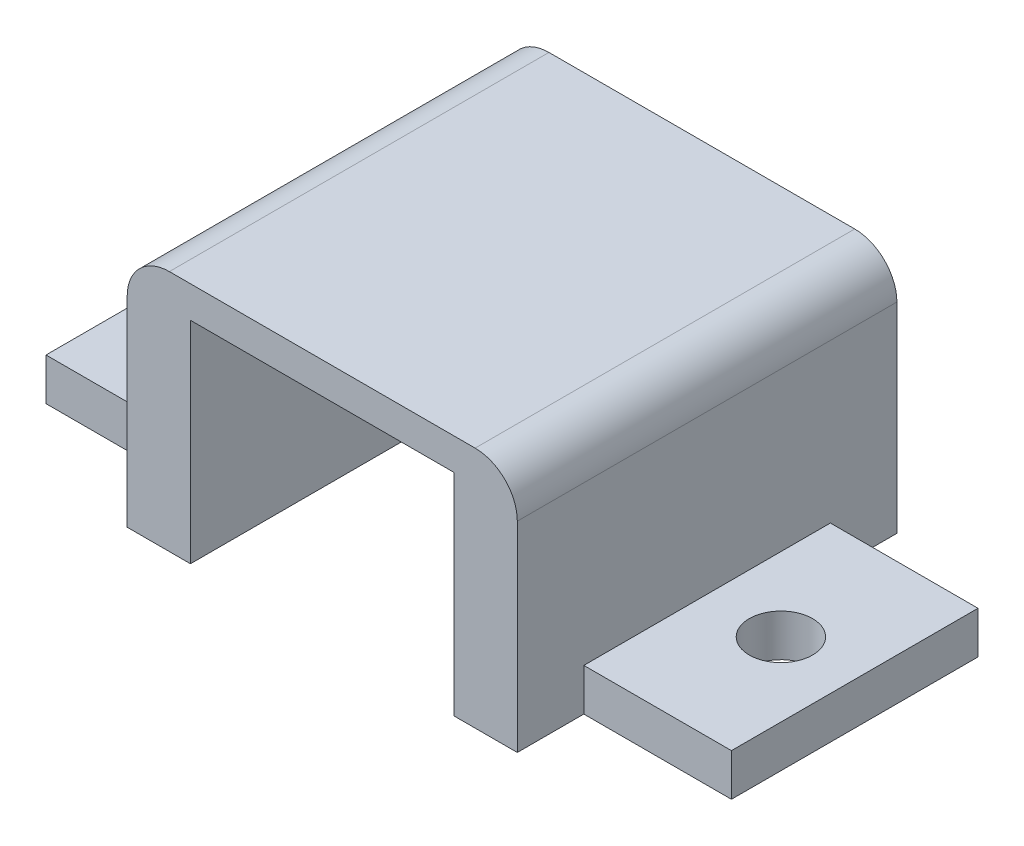
ISO-10303-21;
HEADER;
FILE_DESCRIPTION(('STEP AP214'),'2;1');
FILE_NAME('part.step','',(''),(''),'','','');
FILE_SCHEMA(('AUTOMOTIVE_DESIGN { 1 0 10303 214 1 1 1 1 }'));
ENDSEC;
DATA;
#1=APPLICATION_CONTEXT('core data for automotive mechanical design processes');
#2=APPLICATION_PROTOCOL_DEFINITION('international standard','automotive_design',2000,#1);
#3=PRODUCT_CONTEXT('',#1,'mechanical');
#4=PRODUCT('Part','Part','',(#3));
#5=PRODUCT_RELATED_PRODUCT_CATEGORY('part','',(#4));
#6=PRODUCT_DEFINITION_FORMATION('','',#4);
#7=PRODUCT_DEFINITION_CONTEXT('part definition',#1,'design');
#8=PRODUCT_DEFINITION('design','',#6,#7);
#9=PRODUCT_DEFINITION_SHAPE('','',#8);
#10=(LENGTH_UNIT() NAMED_UNIT(*) SI_UNIT(.MILLI.,.METRE.));
#11=(NAMED_UNIT(*) PLANE_ANGLE_UNIT() SI_UNIT($,.RADIAN.));
#12=(NAMED_UNIT(*) SI_UNIT($,.STERADIAN.) SOLID_ANGLE_UNIT());
#13=UNCERTAINTY_MEASURE_WITH_UNIT(LENGTH_MEASURE(1.E-05),#10,'distance_accuracy_value','');
#14=(GEOMETRIC_REPRESENTATION_CONTEXT(3) GLOBAL_UNCERTAINTY_ASSIGNED_CONTEXT((#13)) GLOBAL_UNIT_ASSIGNED_CONTEXT((#10,
#11,#12)) REPRESENTATION_CONTEXT('',''));
#15=CARTESIAN_POINT('',(0.,0.,0.));
#16=DIRECTION('',(0.,0.,1.));
#17=DIRECTION('',(1.,0.,0.));
#18=AXIS2_PLACEMENT_3D('',#15,#16,#17);
#19=CARTESIAN_POINT('',(-9.25,0.,18.));
#20=DIRECTION('',(1.,0.,0.));
#21=DIRECTION('',(0.,1.,0.));
#22=AXIS2_PLACEMENT_3D('',#19,#20,#21);
#23=PLANE('',#22);
#24=DIRECTION('',(0.,-1.,0.));
#25=VECTOR('',#24,1.);
#26=CARTESIAN_POINT('',(-9.25,0.,3.15));
#27=LINE('',#26,#25);
#28=CARTESIAN_POINT('',(-9.25,2.,3.15));
#29=VERTEX_POINT('',#28);
#30=CARTESIAN_POINT('',(-9.25,0.,3.15));
#31=VERTEX_POINT('',#30);
#32=EDGE_CURVE('E195',#29,#31,#27,.T.);
#33=ORIENTED_EDGE('',*,*,#32,.F.);
#34=DIRECTION('',(0.,0.,-1.));
#35=VECTOR('',#34,1.);
#36=CARTESIAN_POINT('',(-9.25,2.,3.15));
#37=LINE('',#36,#35);
#38=CARTESIAN_POINT('',(-9.25,2.,14.85));
#39=VERTEX_POINT('',#38);
#40=EDGE_CURVE('E62',#39,#29,#37,.T.);
#41=ORIENTED_EDGE('',*,*,#40,.F.);
#42=DIRECTION('',(0.,1.,0.));
#43=VECTOR('',#42,1.);
#44=CARTESIAN_POINT('',(-9.25,0.,14.85));
#45=LINE('',#44,#43);
#46=CARTESIAN_POINT('',(-9.25,0.,14.85));
#47=VERTEX_POINT('',#46);
#48=EDGE_CURVE('E469',#47,#39,#45,.T.);
#49=ORIENTED_EDGE('',*,*,#48,.F.);
#50=DIRECTION('',(0.,0.,-1.));
#51=VECTOR('',#50,1.);
#52=CARTESIAN_POINT('',(-9.25,0.,18.));
#53=LINE('',#52,#51);
#54=CARTESIAN_POINT('',(-9.25,0.,18.));
#55=VERTEX_POINT('',#54);
#56=EDGE_CURVE('E306',#55,#47,#53,.T.);
#57=ORIENTED_EDGE('',*,*,#56,.F.);
#58=DIRECTION('',(0.,-1.,0.));
#59=VECTOR('',#58,1.);
#60=CARTESIAN_POINT('',(-9.25,0.,18.));
#61=LINE('',#60,#59);
#62=CARTESIAN_POINT('',(-9.25,9.5,18.));
#63=VERTEX_POINT('',#62);
#64=EDGE_CURVE('E274',#63,#55,#61,.T.);
#65=ORIENTED_EDGE('',*,*,#64,.F.);
#66=DIRECTION('',(0.,0.,-1.));
#67=VECTOR('',#66,1.);
#68=CARTESIAN_POINT('',(-9.25,9.5,18.));
#69=LINE('',#68,#67);
#70=CARTESIAN_POINT('',(-9.25,9.5,0.));
#71=VERTEX_POINT('',#70);
#72=EDGE_CURVE('E309',#63,#71,#69,.T.);
#73=ORIENTED_EDGE('',*,*,#72,.T.);
#74=DIRECTION('',(0.,-1.,0.));
#75=VECTOR('',#74,1.);
#76=CARTESIAN_POINT('',(-9.25,0.,0.));
#77=LINE('',#76,#75);
#78=CARTESIAN_POINT('',(-9.25,0.,0.));
#79=VERTEX_POINT('',#78);
#80=EDGE_CURVE('E250',#71,#79,#77,.T.);
#81=ORIENTED_EDGE('',*,*,#80,.T.);
#82=EDGE_CURVE('E68',#31,#79,#53,.T.);
#83=ORIENTED_EDGE('',*,*,#82,.F.);
#84=EDGE_LOOP('',(#33,#41,#49,#57,#65,#73,#81,#83));
#85=FACE_BOUND('',#84,.T.);
#86=ADVANCED_FACE('F45',(#85),#23,.F.);
#87=CARTESIAN_POINT('',(9.25,9.5,18.));
#88=DIRECTION('',(-1.,0.,0.));
#89=DIRECTION('',(0.,-1.,0.));
#90=AXIS2_PLACEMENT_3D('',#87,#88,#89);
#91=PLANE('',#90);
#92=DIRECTION('',(0.,-1.,0.));
#93=VECTOR('',#92,1.);
#94=CARTESIAN_POINT('',(9.25,0.,14.846138672784));
#95=LINE('',#94,#93);
#96=CARTESIAN_POINT('',(9.25,2.,14.846138672784));
#97=VERTEX_POINT('',#96);
#98=CARTESIAN_POINT('',(9.25,0.,14.846138672784));
#99=VERTEX_POINT('',#98);
#100=EDGE_CURVE('E197',#97,#99,#95,.T.);
#101=ORIENTED_EDGE('',*,*,#100,.F.);
#102=DIRECTION('',(0.,0.,1.));
#103=VECTOR('',#102,1.);
#104=CARTESIAN_POINT('',(9.25,2.,14.846138672784));
#105=LINE('',#104,#103);
#106=CARTESIAN_POINT('',(9.25,2.,3.15386132721602));
#107=VERTEX_POINT('',#106);
#108=EDGE_CURVE('E213',#107,#97,#105,.T.);
#109=ORIENTED_EDGE('',*,*,#108,.F.);
#110=DIRECTION('',(0.,1.,0.));
#111=VECTOR('',#110,1.);
#112=CARTESIAN_POINT('',(9.25,0.,3.15386132721602));
#113=LINE('',#112,#111);
#114=CARTESIAN_POINT('',(9.25,0.,3.15386132721602));
#115=VERTEX_POINT('',#114);
#116=EDGE_CURVE('E202',#115,#107,#113,.T.);
#117=ORIENTED_EDGE('',*,*,#116,.F.);
#118=DIRECTION('',(0.,0.,-1.));
#119=VECTOR('',#118,1.);
#120=CARTESIAN_POINT('',(9.25,0.,18.));
#121=LINE('',#120,#119);
#122=CARTESIAN_POINT('',(9.25,0.,0.));
#123=VERTEX_POINT('',#122);
#124=EDGE_CURVE('E325',#115,#123,#121,.T.);
#125=ORIENTED_EDGE('',*,*,#124,.T.);
#126=DIRECTION('',(0.,1.,0.));
#127=VECTOR('',#126,1.);
#128=CARTESIAN_POINT('',(9.25,9.5,0.));
#129=LINE('',#128,#127);
#130=CARTESIAN_POINT('',(9.25,9.5,0.));
#131=VERTEX_POINT('',#130);
#132=EDGE_CURVE('E292',#123,#131,#129,.T.);
#133=ORIENTED_EDGE('',*,*,#132,.T.);
#134=DIRECTION('',(0.,0.,-1.));
#135=VECTOR('',#134,1.);
#136=CARTESIAN_POINT('',(9.25,9.5,18.));
#137=LINE('',#136,#135);
#138=CARTESIAN_POINT('',(9.25,9.5,18.));
#139=VERTEX_POINT('',#138);
#140=EDGE_CURVE('E321',#139,#131,#137,.T.);
#141=ORIENTED_EDGE('',*,*,#140,.F.);
#142=DIRECTION('',(0.,1.,0.));
#143=VECTOR('',#142,1.);
#144=CARTESIAN_POINT('',(9.25,9.5,18.));
#145=LINE('',#144,#143);
#146=CARTESIAN_POINT('',(9.25,0.,18.));
#147=VERTEX_POINT('',#146);
#148=EDGE_CURVE('E262',#147,#139,#145,.T.);
#149=ORIENTED_EDGE('',*,*,#148,.F.);
#150=EDGE_CURVE('E326',#147,#99,#121,.T.);
#151=ORIENTED_EDGE('',*,*,#150,.T.);
#152=EDGE_LOOP('',(#101,#109,#117,#125,#133,#141,#149,#151));
#153=FACE_BOUND('',#152,.T.);
#154=ADVANCED_FACE('F387',(#153),#91,.F.);
#155=CARTESIAN_POINT('',(-6.25,0.,18.));
#156=DIRECTION('',(0.,1.,0.));
#157=DIRECTION('',(-1.,0.,0.));
#158=AXIS2_PLACEMENT_3D('',#155,#156,#157);
#159=PLANE('',#158);
#160=CARTESIAN_POINT('',(-12.75,0.,9.));
#161=DIRECTION('',(0.,-1.,0.));
#162=DIRECTION('',(0.,0.,-1.));
#163=AXIS2_PLACEMENT_3D('',#160,#161,#162);
#164=CIRCLE('',#163,1.49999999999999);
#165=CARTESIAN_POINT('',(-12.75,0.,7.50000000000001));
#166=VERTEX_POINT('',#165);
#167=EDGE_CURVE('E448',#166,#166,#164,.T.);
#168=ORIENTED_EDGE('',*,*,#167,.F.);
#169=EDGE_LOOP('',(#168));
#170=FACE_BOUND('',#169,.T.);
#171=DIRECTION('',(1.,0.,0.));
#172=VECTOR('',#171,1.);
#173=CARTESIAN_POINT('',(-6.25,0.,0.));
#174=LINE('',#173,#172);
#175=CARTESIAN_POINT('',(-6.25,0.,0.));
#176=VERTEX_POINT('',#175);
#177=EDGE_CURVE('E244',#79,#176,#174,.T.);
#178=ORIENTED_EDGE('',*,*,#177,.T.);
#179=DIRECTION('',(0.,0.,-1.));
#180=VECTOR('',#179,1.);
#181=CARTESIAN_POINT('',(-6.25,0.,18.));
#182=LINE('',#181,#180);
#183=CARTESIAN_POINT('',(-6.25,0.,18.));
#184=VERTEX_POINT('',#183);
#185=EDGE_CURVE('E11',#184,#176,#182,.T.);
#186=ORIENTED_EDGE('',*,*,#185,.F.);
#187=DIRECTION('',(1.,0.,0.));
#188=VECTOR('',#187,1.);
#189=CARTESIAN_POINT('',(-6.25,0.,18.));
#190=LINE('',#189,#188);
#191=EDGE_CURVE('E245',#55,#184,#190,.T.);
#192=ORIENTED_EDGE('',*,*,#191,.F.);
#193=ORIENTED_EDGE('',*,*,#56,.T.);
#194=DIRECTION('',(1.,0.,0.));
#195=VECTOR('',#194,1.);
#196=CARTESIAN_POINT('',(-16.25,0.,14.85));
#197=LINE('',#196,#195);
#198=CARTESIAN_POINT('',(-16.25,0.,14.85));
#199=VERTEX_POINT('',#198);
#200=EDGE_CURVE('E178',#199,#47,#197,.T.);
#201=ORIENTED_EDGE('',*,*,#200,.F.);
#202=DIRECTION('',(0.,0.,1.));
#203=VECTOR('',#202,1.);
#204=CARTESIAN_POINT('',(-16.25,0.,3.15));
#205=LINE('',#204,#203);
#206=CARTESIAN_POINT('',(-16.25,0.,3.15));
#207=VERTEX_POINT('',#206);
#208=EDGE_CURVE('E170',#207,#199,#205,.T.);
#209=ORIENTED_EDGE('',*,*,#208,.F.);
#210=DIRECTION('',(1.,0.,0.));
#211=VECTOR('',#210,1.);
#212=CARTESIAN_POINT('',(-16.25,0.,3.15));
#213=LINE('',#212,#211);
#214=EDGE_CURVE('E174',#207,#31,#213,.T.);
#215=ORIENTED_EDGE('',*,*,#214,.T.);
#216=ORIENTED_EDGE('',*,*,#82,.T.);
#217=EDGE_LOOP('',(#178,#186,#192,#193,#201,#209,#215,#216));
#218=FACE_BOUND('',#217,.T.);
#219=ADVANCED_FACE('F47',(#170,#218),#159,.F.);
#220=CARTESIAN_POINT('',(-6.25,10.,18.));
#221=DIRECTION('',(-1.,0.,0.));
#222=DIRECTION('',(0.,0.,1.));
#223=AXIS2_PLACEMENT_3D('',#220,#221,#222);
#224=PLANE('',#223);
#225=DIRECTION('',(0.,1.,0.));
#226=VECTOR('',#225,1.);
#227=CARTESIAN_POINT('',(-6.25,10.,0.));
#228=LINE('',#227,#226);
#229=CARTESIAN_POINT('',(-6.25,10.,0.));
#230=VERTEX_POINT('',#229);
#231=EDGE_CURVE('E279',#176,#230,#228,.T.);
#232=ORIENTED_EDGE('',*,*,#231,.T.);
#233=DIRECTION('',(0.,0.,-1.));
#234=VECTOR('',#233,1.);
#235=CARTESIAN_POINT('',(-6.25,10.,18.));
#236=LINE('',#235,#234);
#237=CARTESIAN_POINT('',(-6.25,10.,18.));
#238=VERTEX_POINT('',#237);
#239=EDGE_CURVE('E55',#238,#230,#236,.T.);
#240=ORIENTED_EDGE('',*,*,#239,.F.);
#241=DIRECTION('',(0.,1.,0.));
#242=VECTOR('',#241,1.);
#243=CARTESIAN_POINT('',(-6.25,10.,18.));
#244=LINE('',#243,#242);
#245=EDGE_CURVE('E249',#184,#238,#244,.T.);
#246=ORIENTED_EDGE('',*,*,#245,.F.);
#247=ORIENTED_EDGE('',*,*,#185,.T.);
#248=EDGE_LOOP('',(#232,#240,#246,#247));
#249=FACE_BOUND('',#248,.T.);
#250=ADVANCED_FACE('F367',(#249),#224,.F.);
#251=CARTESIAN_POINT('',(6.25,10.,18.));
#252=DIRECTION('',(0.,1.,0.));
#253=DIRECTION('',(0.,0.,1.));
#254=AXIS2_PLACEMENT_3D('',#251,#252,#253);
#255=PLANE('',#254);
#256=DIRECTION('',(1.,0.,0.));
#257=VECTOR('',#256,1.);
#258=CARTESIAN_POINT('',(6.25,10.,0.));
#259=LINE('',#258,#257);
#260=CARTESIAN_POINT('',(6.25,10.,0.));
#261=VERTEX_POINT('',#260);
#262=EDGE_CURVE('E282',#230,#261,#259,.T.);
#263=ORIENTED_EDGE('',*,*,#262,.T.);
#264=DIRECTION('',(0.,0.,-1.));
#265=VECTOR('',#264,1.);
#266=CARTESIAN_POINT('',(6.25,10.,18.));
#267=LINE('',#266,#265);
#268=CARTESIAN_POINT('',(6.25,10.,18.));
#269=VERTEX_POINT('',#268);
#270=EDGE_CURVE('E333',#269,#261,#267,.T.);
#271=ORIENTED_EDGE('',*,*,#270,.F.);
#272=DIRECTION('',(1.,0.,0.));
#273=VECTOR('',#272,1.);
#274=CARTESIAN_POINT('',(6.25,10.,18.));
#275=LINE('',#274,#273);
#276=EDGE_CURVE('E253',#238,#269,#275,.T.);
#277=ORIENTED_EDGE('',*,*,#276,.F.);
#278=ORIENTED_EDGE('',*,*,#239,.T.);
#279=EDGE_LOOP('',(#263,#271,#277,#278));
#280=FACE_BOUND('',#279,.T.);
#281=ADVANCED_FACE('F343',(#280),#255,.F.);
#282=CARTESIAN_POINT('',(6.25,0.,18.));
#283=DIRECTION('',(1.,0.,0.));
#284=DIRECTION('',(0.,0.,-1.));
#285=AXIS2_PLACEMENT_3D('',#282,#283,#284);
#286=PLANE('',#285);
#287=DIRECTION('',(0.,-1.,0.));
#288=VECTOR('',#287,1.);
#289=CARTESIAN_POINT('',(6.25,0.,0.));
#290=LINE('',#289,#288);
#291=CARTESIAN_POINT('',(6.25,0.,0.));
#292=VERTEX_POINT('',#291);
#293=EDGE_CURVE('E285',#261,#292,#290,.T.);
#294=ORIENTED_EDGE('',*,*,#293,.T.);
#295=DIRECTION('',(0.,0.,-1.));
#296=VECTOR('',#295,1.);
#297=CARTESIAN_POINT('',(6.25,0.,18.));
#298=LINE('',#297,#296);
#299=CARTESIAN_POINT('',(6.25,0.,18.));
#300=VERTEX_POINT('',#299);
#301=EDGE_CURVE('E329',#300,#292,#298,.T.);
#302=ORIENTED_EDGE('',*,*,#301,.F.);
#303=DIRECTION('',(0.,-1.,0.));
#304=VECTOR('',#303,1.);
#305=CARTESIAN_POINT('',(6.25,0.,18.));
#306=LINE('',#305,#304);
#307=EDGE_CURVE('E256',#269,#300,#306,.T.);
#308=ORIENTED_EDGE('',*,*,#307,.F.);
#309=ORIENTED_EDGE('',*,*,#270,.T.);
#310=EDGE_LOOP('',(#294,#302,#308,#309));
#311=FACE_BOUND('',#310,.T.);
#312=ADVANCED_FACE('F354',(#311),#286,.F.);
#313=CARTESIAN_POINT('',(9.25,0.,18.));
#314=DIRECTION('',(0.,1.,0.));
#315=DIRECTION('',(-1.,0.,0.));
#316=AXIS2_PLACEMENT_3D('',#313,#314,#315);
#317=PLANE('',#316);
#318=CARTESIAN_POINT('',(12.75,0.,9.));
#319=DIRECTION('',(0.,-1.,0.));
#320=DIRECTION('',(0.,0.,-1.));
#321=AXIS2_PLACEMENT_3D('',#318,#319,#320);
#322=CIRCLE('',#321,1.49999999999999);
#323=CARTESIAN_POINT('',(12.75,0.,7.50000000000001));
#324=VERTEX_POINT('',#323);
#325=EDGE_CURVE('E454',#324,#324,#322,.T.);
#326=ORIENTED_EDGE('',*,*,#325,.F.);
#327=EDGE_LOOP('',(#326));
#328=FACE_BOUND('',#327,.T.);
#329=DIRECTION('',(1.,0.,0.));
#330=VECTOR('',#329,1.);
#331=CARTESIAN_POINT('',(9.25,0.,0.));
#332=LINE('',#331,#330);
#333=EDGE_CURVE('E288',#292,#123,#332,.T.);
#334=ORIENTED_EDGE('',*,*,#333,.T.);
#335=ORIENTED_EDGE('',*,*,#124,.F.);
#336=DIRECTION('',(-1.,0.,0.));
#337=VECTOR('',#336,1.);
#338=CARTESIAN_POINT('',(16.25,0.,3.15386132721602));
#339=LINE('',#338,#337);
#340=CARTESIAN_POINT('',(16.25,0.,3.15386132721602));
#341=VERTEX_POINT('',#340);
#342=EDGE_CURVE('E236',#341,#115,#339,.T.);
#343=ORIENTED_EDGE('',*,*,#342,.F.);
#344=DIRECTION('',(0.,0.,-1.));
#345=VECTOR('',#344,1.);
#346=CARTESIAN_POINT('',(16.25,0.,14.846138672784));
#347=LINE('',#346,#345);
#348=CARTESIAN_POINT('',(16.25,0.,14.846138672784));
#349=VERTEX_POINT('',#348);
#350=EDGE_CURVE('E212',#349,#341,#347,.T.);
#351=ORIENTED_EDGE('',*,*,#350,.F.);
#352=DIRECTION('',(-1.,0.,0.));
#353=VECTOR('',#352,1.);
#354=CARTESIAN_POINT('',(16.25,0.,14.846138672784));
#355=LINE('',#354,#353);
#356=EDGE_CURVE('E240',#349,#99,#355,.T.);
#357=ORIENTED_EDGE('',*,*,#356,.T.);
#358=ORIENTED_EDGE('',*,*,#150,.F.);
#359=DIRECTION('',(1.,0.,0.));
#360=VECTOR('',#359,1.);
#361=CARTESIAN_POINT('',(9.25,0.,18.));
#362=LINE('',#361,#360);
#363=EDGE_CURVE('E259',#300,#147,#362,.T.);
#364=ORIENTED_EDGE('',*,*,#363,.F.);
#365=ORIENTED_EDGE('',*,*,#301,.T.);
#366=EDGE_LOOP('',(#334,#335,#343,#351,#357,#358,#364,#365));
#367=FACE_BOUND('',#366,.T.);
#368=ADVANCED_FACE('F358',(#328,#367),#317,.F.);
#369=CARTESIAN_POINT('',(7.25,9.5,18.));
#370=DIRECTION('',(0.,0.,-1.));
#371=DIRECTION('',(-1.,0.,0.));
#372=AXIS2_PLACEMENT_3D('',#369,#370,#371);
#373=CYLINDRICAL_SURFACE('',#372,2.);
#374=CARTESIAN_POINT('',(7.25,9.5,0.));
#375=DIRECTION('',(0.,0.,1.));
#376=DIRECTION('',(-1.,0.,0.));
#377=AXIS2_PLACEMENT_3D('',#374,#375,#376);
#378=CIRCLE('',#377,2.);
#379=CARTESIAN_POINT('',(7.25,11.5,0.));
#380=VERTEX_POINT('',#379);
#381=EDGE_CURVE('E295',#131,#380,#378,.T.);
#382=ORIENTED_EDGE('',*,*,#381,.T.);
#383=DIRECTION('',(0.,0.,-1.));
#384=VECTOR('',#383,1.);
#385=CARTESIAN_POINT('',(7.25,11.5,18.));
#386=LINE('',#385,#384);
#387=CARTESIAN_POINT('',(7.25,11.5,18.));
#388=VERTEX_POINT('',#387);
#389=EDGE_CURVE('E317',#388,#380,#386,.T.);
#390=ORIENTED_EDGE('',*,*,#389,.F.);
#391=CARTESIAN_POINT('',(7.25,9.5,18.));
#392=DIRECTION('',(0.,0.,1.));
#393=DIRECTION('',(-1.,0.,0.));
#394=AXIS2_PLACEMENT_3D('',#391,#392,#393);
#395=CIRCLE('',#394,2.);
#396=EDGE_CURVE('E265',#139,#388,#395,.T.);
#397=ORIENTED_EDGE('',*,*,#396,.F.);
#398=ORIENTED_EDGE('',*,*,#140,.T.);
#399=EDGE_LOOP('',(#382,#390,#397,#398));
#400=FACE_BOUND('',#399,.T.);
#401=ADVANCED_FACE('F384',(#400),#373,.T.);
#402=CARTESIAN_POINT('',(-7.25,11.5,18.));
#403=DIRECTION('',(0.,-1.,0.));
#404=DIRECTION('',(0.,0.,-1.));
#405=AXIS2_PLACEMENT_3D('',#402,#403,#404);
#406=PLANE('',#405);
#407=DIRECTION('',(-1.,0.,0.));
#408=VECTOR('',#407,1.);
#409=CARTESIAN_POINT('',(-7.25,11.5,0.));
#410=LINE('',#409,#408);
#411=CARTESIAN_POINT('',(-7.25,11.5,0.));
#412=VERTEX_POINT('',#411);
#413=EDGE_CURVE('E298',#380,#412,#410,.T.);
#414=ORIENTED_EDGE('',*,*,#413,.T.);
#415=DIRECTION('',(0.,0.,-1.));
#416=VECTOR('',#415,1.);
#417=CARTESIAN_POINT('',(-7.25,11.5,18.));
#418=LINE('',#417,#416);
#419=CARTESIAN_POINT('',(-7.25,11.5,18.));
#420=VERTEX_POINT('',#419);
#421=EDGE_CURVE('E313',#420,#412,#418,.T.);
#422=ORIENTED_EDGE('',*,*,#421,.F.);
#423=DIRECTION('',(-1.,0.,0.));
#424=VECTOR('',#423,1.);
#425=CARTESIAN_POINT('',(-7.25,11.5,18.));
#426=LINE('',#425,#424);
#427=EDGE_CURVE('E268',#388,#420,#426,.T.);
#428=ORIENTED_EDGE('',*,*,#427,.F.);
#429=ORIENTED_EDGE('',*,*,#389,.T.);
#430=EDGE_LOOP('',(#414,#422,#428,#429));
#431=FACE_BOUND('',#430,.T.);
#432=ADVANCED_FACE('F380',(#431),#406,.F.);
#433=CARTESIAN_POINT('',(-7.25,9.5,18.));
#434=DIRECTION('',(0.,0.,-1.));
#435=DIRECTION('',(-1.,0.,0.));
#436=AXIS2_PLACEMENT_3D('',#433,#434,#435);
#437=CYLINDRICAL_SURFACE('',#436,2.);
#438=CARTESIAN_POINT('',(-7.25,9.5,0.));
#439=DIRECTION('',(0.,0.,1.));
#440=DIRECTION('',(-1.,0.,0.));
#441=AXIS2_PLACEMENT_3D('',#438,#439,#440);
#442=CIRCLE('',#441,2.);
#443=EDGE_CURVE('E301',#412,#71,#442,.T.);
#444=ORIENTED_EDGE('',*,*,#443,.T.);
#445=ORIENTED_EDGE('',*,*,#72,.F.);
#446=CARTESIAN_POINT('',(-7.25,9.5,18.));
#447=DIRECTION('',(0.,0.,1.));
#448=DIRECTION('',(-1.,0.,0.));
#449=AXIS2_PLACEMENT_3D('',#446,#447,#448);
#450=CIRCLE('',#449,2.);
#451=EDGE_CURVE('E271',#420,#63,#450,.T.);
#452=ORIENTED_EDGE('',*,*,#451,.F.);
#453=ORIENTED_EDGE('',*,*,#421,.T.);
#454=EDGE_LOOP('',(#444,#445,#452,#453));
#455=FACE_BOUND('',#454,.T.);
#456=ADVANCED_FACE('F376',(#455),#437,.T.);
#457=CARTESIAN_POINT('',(-7.25,9.5,18.));
#458=DIRECTION('',(0.,0.,-1.));
#459=DIRECTION('',(-1.,0.,0.));
#460=AXIS2_PLACEMENT_3D('',#457,#458,#459);
#461=PLANE('',#460);
#462=ORIENTED_EDGE('',*,*,#191,.T.);
#463=ORIENTED_EDGE('',*,*,#245,.T.);
#464=ORIENTED_EDGE('',*,*,#276,.T.);
#465=ORIENTED_EDGE('',*,*,#307,.T.);
#466=ORIENTED_EDGE('',*,*,#363,.T.);
#467=ORIENTED_EDGE('',*,*,#148,.T.);
#468=ORIENTED_EDGE('',*,*,#396,.T.);
#469=ORIENTED_EDGE('',*,*,#427,.T.);
#470=ORIENTED_EDGE('',*,*,#451,.T.);
#471=ORIENTED_EDGE('',*,*,#64,.T.);
#472=EDGE_LOOP('',(#462,#463,#464,#465,#466,#467,#468,#469,#470,#471));
#473=FACE_BOUND('',#472,.T.);
#474=ADVANCED_FACE('F363',(#473),#461,.F.);
#475=CARTESIAN_POINT('',(-7.25,9.5,0.));
#476=DIRECTION('',(0.,0.,-1.));
#477=DIRECTION('',(-1.,0.,0.));
#478=AXIS2_PLACEMENT_3D('',#475,#476,#477);
#479=PLANE('',#478);
#480=ORIENTED_EDGE('',*,*,#177,.F.);
#481=ORIENTED_EDGE('',*,*,#80,.F.);
#482=ORIENTED_EDGE('',*,*,#443,.F.);
#483=ORIENTED_EDGE('',*,*,#413,.F.);
#484=ORIENTED_EDGE('',*,*,#381,.F.);
#485=ORIENTED_EDGE('',*,*,#132,.F.);
#486=ORIENTED_EDGE('',*,*,#333,.F.);
#487=ORIENTED_EDGE('',*,*,#293,.F.);
#488=ORIENTED_EDGE('',*,*,#262,.F.);
#489=ORIENTED_EDGE('',*,*,#231,.F.);
#490=EDGE_LOOP('',(#480,#481,#482,#483,#484,#485,#486,#487,#488,#489));
#491=FACE_BOUND('',#490,.T.);
#492=ADVANCED_FACE('F349',(#491),#479,.T.);
#493=CARTESIAN_POINT('',(16.25,0.,14.846138672784));
#494=DIRECTION('',(0.,0.,-1.));
#495=DIRECTION('',(-1.,0.,0.));
#496=AXIS2_PLACEMENT_3D('',#493,#494,#495);
#497=PLANE('',#496);
#498=ORIENTED_EDGE('',*,*,#100,.T.);
#499=ORIENTED_EDGE('',*,*,#356,.F.);
#500=DIRECTION('',(0.,-1.,0.));
#501=VECTOR('',#500,1.);
#502=CARTESIAN_POINT('',(16.25,0.,14.846138672784));
#503=LINE('',#502,#501);
#504=CARTESIAN_POINT('',(16.25,2.,14.846138672784));
#505=VERTEX_POINT('',#504);
#506=EDGE_CURVE('E208',#505,#349,#503,.T.);
#507=ORIENTED_EDGE('',*,*,#506,.F.);
#508=DIRECTION('',(-1.,0.,0.));
#509=VECTOR('',#508,1.);
#510=CARTESIAN_POINT('',(16.25,2.,14.846138672784));
#511=LINE('',#510,#509);
#512=EDGE_CURVE('E221',#505,#97,#511,.T.);
#513=ORIENTED_EDGE('',*,*,#512,.T.);
#514=EDGE_LOOP('',(#498,#499,#507,#513));
#515=FACE_BOUND('',#514,.T.);
#516=ADVANCED_FACE('F402',(#515),#497,.F.);
#517=CARTESIAN_POINT('',(16.25,0.,3.15386132721602));
#518=DIRECTION('',(0.,0.,1.));
#519=DIRECTION('',(0.,-1.,0.));
#520=AXIS2_PLACEMENT_3D('',#517,#518,#519);
#521=PLANE('',#520);
#522=ORIENTED_EDGE('',*,*,#116,.T.);
#523=DIRECTION('',(-1.,0.,0.));
#524=VECTOR('',#523,1.);
#525=CARTESIAN_POINT('',(16.25,2.,3.15386132721602));
#526=LINE('',#525,#524);
#527=CARTESIAN_POINT('',(16.25,2.,3.15386132721602));
#528=VERTEX_POINT('',#527);
#529=EDGE_CURVE('E232',#528,#107,#526,.T.);
#530=ORIENTED_EDGE('',*,*,#529,.F.);
#531=DIRECTION('',(0.,1.,0.));
#532=VECTOR('',#531,1.);
#533=CARTESIAN_POINT('',(16.25,0.,3.15386132721602));
#534=LINE('',#533,#532);
#535=EDGE_CURVE('E216',#341,#528,#534,.T.);
#536=ORIENTED_EDGE('',*,*,#535,.F.);
#537=ORIENTED_EDGE('',*,*,#342,.T.);
#538=EDGE_LOOP('',(#522,#530,#536,#537));
#539=FACE_BOUND('',#538,.T.);
#540=ADVANCED_FACE('F393',(#539),#521,.F.);
#541=CARTESIAN_POINT('',(16.25,2.,14.846138672784));
#542=DIRECTION('',(0.,-1.,0.));
#543=DIRECTION('',(1.,0.,0.));
#544=AXIS2_PLACEMENT_3D('',#541,#542,#543);
#545=PLANE('',#544);
#546=CARTESIAN_POINT('',(12.75,2.,9.));
#547=DIRECTION('',(0.,-1.,0.));
#548=DIRECTION('',(1.,0.,0.));
#549=AXIS2_PLACEMENT_3D('',#546,#547,#548);
#550=CIRCLE('',#549,1.49999999999999);
#551=CARTESIAN_POINT('',(14.25,2.,9.));
#552=VERTEX_POINT('',#551);
#553=EDGE_CURVE('E459',#552,#552,#550,.T.);
#554=ORIENTED_EDGE('',*,*,#553,.T.);
#555=EDGE_LOOP('',(#554));
#556=FACE_BOUND('',#555,.T.);
#557=ORIENTED_EDGE('',*,*,#108,.T.);
#558=ORIENTED_EDGE('',*,*,#512,.F.);
#559=DIRECTION('',(0.,0.,1.));
#560=VECTOR('',#559,1.);
#561=CARTESIAN_POINT('',(16.25,2.,14.846138672784));
#562=LINE('',#561,#560);
#563=EDGE_CURVE('E219',#528,#505,#562,.T.);
#564=ORIENTED_EDGE('',*,*,#563,.F.);
#565=ORIENTED_EDGE('',*,*,#529,.T.);
#566=EDGE_LOOP('',(#557,#558,#564,#565));
#567=FACE_BOUND('',#566,.T.);
#568=ADVANCED_FACE('F404',(#556,#567),#545,.F.);
#569=CARTESIAN_POINT('',(16.25,0.,0.));
#570=DIRECTION('',(-1.,0.,0.));
#571=DIRECTION('',(0.,0.,1.));
#572=AXIS2_PLACEMENT_3D('',#569,#570,#571);
#573=PLANE('',#572);
#574=ORIENTED_EDGE('',*,*,#506,.T.);
#575=ORIENTED_EDGE('',*,*,#350,.T.);
#576=ORIENTED_EDGE('',*,*,#535,.T.);
#577=ORIENTED_EDGE('',*,*,#563,.T.);
#578=EDGE_LOOP('',(#574,#575,#576,#577));
#579=FACE_BOUND('',#578,.T.);
#580=ADVANCED_FACE('F397',(#579),#573,.F.);
#581=CARTESIAN_POINT('',(-16.25,0.,3.15));
#582=DIRECTION('',(0.,0.,1.));
#583=DIRECTION('',(1.,0.,0.));
#584=AXIS2_PLACEMENT_3D('',#581,#582,#583);
#585=PLANE('',#584);
#586=ORIENTED_EDGE('',*,*,#32,.T.);
#587=ORIENTED_EDGE('',*,*,#214,.F.);
#588=DIRECTION('',(0.,-1.,0.));
#589=VECTOR('',#588,1.);
#590=CARTESIAN_POINT('',(-16.25,0.,3.15));
#591=LINE('',#590,#589);
#592=CARTESIAN_POINT('',(-16.25,2.,3.15));
#593=VERTEX_POINT('',#592);
#594=EDGE_CURVE('E183',#593,#207,#591,.T.);
#595=ORIENTED_EDGE('',*,*,#594,.F.);
#596=DIRECTION('',(1.,0.,0.));
#597=VECTOR('',#596,1.);
#598=CARTESIAN_POINT('',(-16.25,2.,3.15));
#599=LINE('',#598,#597);
#600=EDGE_CURVE('E466',#593,#29,#599,.T.);
#601=ORIENTED_EDGE('',*,*,#600,.T.);
#602=EDGE_LOOP('',(#586,#587,#595,#601));
#603=FACE_BOUND('',#602,.T.);
#604=ADVANCED_FACE('F194',(#603),#585,.F.);
#605=CARTESIAN_POINT('',(-16.25,0.,14.85));
#606=DIRECTION('',(0.,0.,-1.));
#607=DIRECTION('',(-1.,0.,0.));
#608=AXIS2_PLACEMENT_3D('',#605,#606,#607);
#609=PLANE('',#608);
#610=ORIENTED_EDGE('',*,*,#48,.T.);
#611=DIRECTION('',(1.,0.,0.));
#612=VECTOR('',#611,1.);
#613=CARTESIAN_POINT('',(-16.25,2.,14.85));
#614=LINE('',#613,#612);
#615=CARTESIAN_POINT('',(-16.25,2.,14.85));
#616=VERTEX_POINT('',#615);
#617=EDGE_CURVE('E204',#616,#39,#614,.T.);
#618=ORIENTED_EDGE('',*,*,#617,.F.);
#619=DIRECTION('',(0.,1.,0.));
#620=VECTOR('',#619,1.);
#621=CARTESIAN_POINT('',(-16.25,0.,14.85));
#622=LINE('',#621,#620);
#623=EDGE_CURVE('E182',#199,#616,#622,.T.);
#624=ORIENTED_EDGE('',*,*,#623,.F.);
#625=ORIENTED_EDGE('',*,*,#200,.T.);
#626=EDGE_LOOP('',(#610,#618,#624,#625));
#627=FACE_BOUND('',#626,.T.);
#628=ADVANCED_FACE('F481',(#627),#609,.F.);
#629=CARTESIAN_POINT('',(-16.25,2.,3.15));
#630=DIRECTION('',(0.,-1.,0.));
#631=DIRECTION('',(1.,0.,0.));
#632=AXIS2_PLACEMENT_3D('',#629,#630,#631);
#633=PLANE('',#632);
#634=CARTESIAN_POINT('',(-12.75,2.,9.));
#635=DIRECTION('',(0.,-1.,0.));
#636=DIRECTION('',(1.,0.,0.));
#637=AXIS2_PLACEMENT_3D('',#634,#635,#636);
#638=CIRCLE('',#637,1.49999999999999);
#639=CARTESIAN_POINT('',(-11.25,2.,9.));
#640=VERTEX_POINT('',#639);
#641=EDGE_CURVE('E49',#640,#640,#638,.T.);
#642=ORIENTED_EDGE('',*,*,#641,.T.);
#643=EDGE_LOOP('',(#642));
#644=FACE_BOUND('',#643,.T.);
#645=ORIENTED_EDGE('',*,*,#40,.T.);
#646=ORIENTED_EDGE('',*,*,#600,.F.);
#647=DIRECTION('',(0.,0.,-1.));
#648=VECTOR('',#647,1.);
#649=CARTESIAN_POINT('',(-16.25,2.,3.15));
#650=LINE('',#649,#648);
#651=EDGE_CURVE('E188',#616,#593,#650,.T.);
#652=ORIENTED_EDGE('',*,*,#651,.F.);
#653=ORIENTED_EDGE('',*,*,#617,.T.);
#654=EDGE_LOOP('',(#645,#646,#652,#653));
#655=FACE_BOUND('',#654,.T.);
#656=ADVANCED_FACE('F479',(#644,#655),#633,.F.);
#657=CARTESIAN_POINT('',(-16.25,0.,0.));
#658=DIRECTION('',(1.,0.,0.));
#659=DIRECTION('',(0.,0.,-1.));
#660=AXIS2_PLACEMENT_3D('',#657,#658,#659);
#661=PLANE('',#660);
#662=ORIENTED_EDGE('',*,*,#594,.T.);
#663=ORIENTED_EDGE('',*,*,#208,.T.);
#664=ORIENTED_EDGE('',*,*,#623,.T.);
#665=ORIENTED_EDGE('',*,*,#651,.T.);
#666=EDGE_LOOP('',(#662,#663,#664,#665));
#667=FACE_BOUND('',#666,.T.);
#668=ADVANCED_FACE('F186',(#667),#661,.F.);
#669=CARTESIAN_POINT('',(12.75,0.,9.));
#670=DIRECTION('',(0.,-1.,0.));
#671=DIRECTION('',(0.,0.,-1.));
#672=AXIS2_PLACEMENT_3D('',#669,#670,#671);
#673=CYLINDRICAL_SURFACE('',#672,1.49999999999999);
#674=ORIENTED_EDGE('',*,*,#325,.T.);
#675=EDGE_LOOP('',(#674));
#676=FACE_BOUND('',#675,.T.);
#677=ORIENTED_EDGE('',*,*,#553,.F.);
#678=EDGE_LOOP('',(#677));
#679=FACE_BOUND('',#678,.T.);
#680=ADVANCED_FACE('F491',(#676,#679),#673,.F.);
#681=CARTESIAN_POINT('',(-12.75,0.,9.));
#682=DIRECTION('',(0.,-1.,0.));
#683=DIRECTION('',(0.,0.,-1.));
#684=AXIS2_PLACEMENT_3D('',#681,#682,#683);
#685=CYLINDRICAL_SURFACE('',#684,1.49999999999999);
#686=ORIENTED_EDGE('',*,*,#167,.T.);
#687=EDGE_LOOP('',(#686));
#688=FACE_BOUND('',#687,.T.);
#689=ORIENTED_EDGE('',*,*,#641,.F.);
#690=EDGE_LOOP('',(#689));
#691=FACE_BOUND('',#690,.T.);
#692=ADVANCED_FACE('F494',(#688,#691),#685,.F.);
#693=CLOSED_SHELL('',(#86,#154,#219,#250,#281,#312,#368,#401,#432,#456,#474,#492,#516,#540,#568,
#580,#604,#628,#656,#668,#680,#692));
#694=MANIFOLD_SOLID_BREP('B2',#693);
#695=ADVANCED_BREP_SHAPE_REPRESENTATION('',(#18,#694),#14);
#696=SHAPE_DEFINITION_REPRESENTATION(#9,#695);
ENDSEC;
END-ISO-10303-21;
